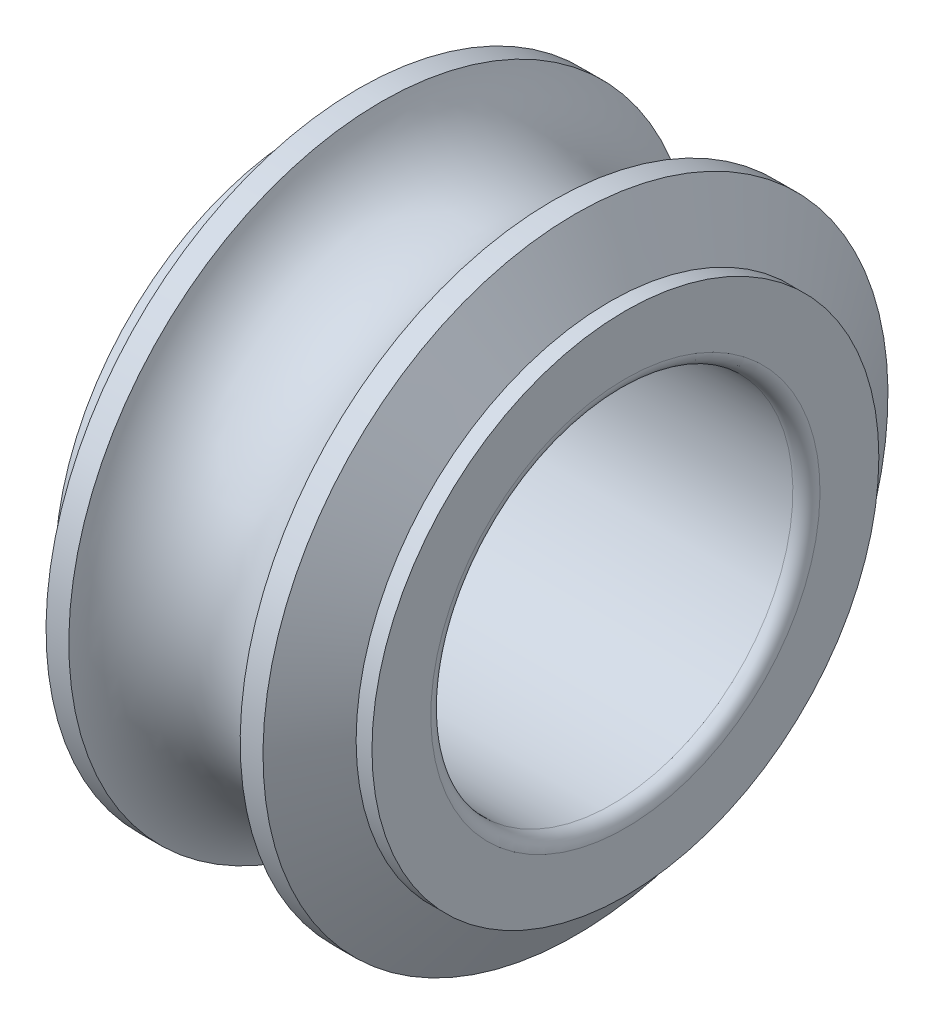
ISO-10303-21;
HEADER;
FILE_DESCRIPTION(('STEP AP214'),'2;1');
FILE_NAME('part.step','',(''),(''),'','','');
FILE_SCHEMA(('AUTOMOTIVE_DESIGN { 1 0 10303 214 1 1 1 1 }'));
ENDSEC;
DATA;
#1=APPLICATION_CONTEXT('core data for automotive mechanical design processes');
#2=APPLICATION_PROTOCOL_DEFINITION('international standard','automotive_design',2000,#1);
#3=PRODUCT_CONTEXT('',#1,'mechanical');
#4=PRODUCT('Part','Part','',(#3));
#5=PRODUCT_RELATED_PRODUCT_CATEGORY('part','',(#4));
#6=PRODUCT_DEFINITION_FORMATION('','',#4);
#7=PRODUCT_DEFINITION_CONTEXT('part definition',#1,'design');
#8=PRODUCT_DEFINITION('design','',#6,#7);
#9=PRODUCT_DEFINITION_SHAPE('','',#8);
#10=(LENGTH_UNIT() NAMED_UNIT(*) SI_UNIT(.MILLI.,.METRE.));
#11=(NAMED_UNIT(*) PLANE_ANGLE_UNIT() SI_UNIT($,.RADIAN.));
#12=(NAMED_UNIT(*) SI_UNIT($,.STERADIAN.) SOLID_ANGLE_UNIT());
#13=UNCERTAINTY_MEASURE_WITH_UNIT(LENGTH_MEASURE(1.E-05),#10,'distance_accuracy_value','');
#14=(GEOMETRIC_REPRESENTATION_CONTEXT(3) GLOBAL_UNCERTAINTY_ASSIGNED_CONTEXT((#13)) GLOBAL_UNIT_ASSIGNED_CONTEXT((#10,
#11,#12)) REPRESENTATION_CONTEXT('',''));
#15=CARTESIAN_POINT('',(0.,0.,0.));
#16=DIRECTION('',(0.,0.,1.));
#17=DIRECTION('',(1.,0.,0.));
#18=AXIS2_PLACEMENT_3D('',#15,#16,#17);
#19=CARTESIAN_POINT('',(3.5,0.,0.));
#20=DIRECTION('',(-1.,0.,0.));
#21=DIRECTION('',(0.,1.,0.));
#22=AXIS2_PLACEMENT_3D('',#19,#20,#21);
#23=CYLINDRICAL_SURFACE('',#22,4.);
#24=CARTESIAN_POINT('',(6.7,0.,0.));
#25=DIRECTION('',(1.,0.,0.));
#26=DIRECTION('',(0.,1.,0.));
#27=AXIS2_PLACEMENT_3D('',#24,#25,#26);
#28=CIRCLE('',#27,4.);
#29=CARTESIAN_POINT('',(6.7,4.,0.));
#30=VERTEX_POINT('',#29);
#31=EDGE_CURVE('E11',#30,#30,#28,.T.);
#32=ORIENTED_EDGE('',*,*,#31,.T.);
#33=EDGE_LOOP('',(#32));
#34=FACE_BOUND('',#33,.T.);
#35=CARTESIAN_POINT('',(0.3,0.,0.));
#36=DIRECTION('',(1.,0.,0.));
#37=DIRECTION('',(0.,1.,0.));
#38=AXIS2_PLACEMENT_3D('',#35,#36,#37);
#39=CIRCLE('',#38,4.);
#40=CARTESIAN_POINT('',(0.3,4.,0.));
#41=VERTEX_POINT('',#40);
#42=EDGE_CURVE('E86',#41,#41,#39,.T.);
#43=ORIENTED_EDGE('',*,*,#42,.F.);
#44=EDGE_LOOP('',(#43));
#45=FACE_BOUND('',#44,.T.);
#46=ADVANCED_FACE('F17',(#34,#45),#23,.F.);
#47=CARTESIAN_POINT('',(6.7,0.,0.));
#48=DIRECTION('',(1.,0.,0.));
#49=DIRECTION('',(0.,0.,-1.));
#50=AXIS2_PLACEMENT_3D('',#47,#48,#49);
#51=TOROIDAL_SURFACE('',#50,4.3,0.3);
#52=CARTESIAN_POINT('',(7.,0.,0.));
#53=DIRECTION('',(1.,0.,0.));
#54=DIRECTION('',(0.,1.,0.));
#55=AXIS2_PLACEMENT_3D('',#52,#53,#54);
#56=CIRCLE('',#55,4.3);
#57=CARTESIAN_POINT('',(7.,4.3,0.));
#58=VERTEX_POINT('',#57);
#59=EDGE_CURVE('E27',#58,#58,#56,.T.);
#60=ORIENTED_EDGE('',*,*,#59,.T.);
#61=EDGE_LOOP('',(#60));
#62=FACE_BOUND('',#61,.T.);
#63=ORIENTED_EDGE('',*,*,#31,.F.);
#64=EDGE_LOOP('',(#63));
#65=FACE_BOUND('',#64,.T.);
#66=ADVANCED_FACE('F115',(#62,#65),#51,.T.);
#67=CARTESIAN_POINT('',(7.,4.95,0.));
#68=DIRECTION('',(1.,0.,0.));
#69=DIRECTION('',(0.,1.,0.));
#70=AXIS2_PLACEMENT_3D('',#67,#68,#69);
#71=PLANE('',#70);
#72=CARTESIAN_POINT('',(7.,0.,0.));
#73=DIRECTION('',(1.,0.,0.));
#74=DIRECTION('',(0.,1.,0.));
#75=AXIS2_PLACEMENT_3D('',#72,#73,#74);
#76=CIRCLE('',#75,5.6);
#77=CARTESIAN_POINT('',(7.,5.6,0.));
#78=VERTEX_POINT('',#77);
#79=EDGE_CURVE('E74',#78,#78,#76,.T.);
#80=ORIENTED_EDGE('',*,*,#79,.T.);
#81=EDGE_LOOP('',(#80));
#82=FACE_BOUND('',#81,.T.);
#83=ORIENTED_EDGE('',*,*,#59,.F.);
#84=EDGE_LOOP('',(#83));
#85=FACE_BOUND('',#84,.T.);
#86=ADVANCED_FACE('F120',(#82,#85),#71,.T.);
#87=CARTESIAN_POINT('',(6.825,0.,0.));
#88=DIRECTION('',(-1.,0.,0.));
#89=DIRECTION('',(0.,1.,0.));
#90=AXIS2_PLACEMENT_3D('',#87,#88,#89);
#91=CYLINDRICAL_SURFACE('',#90,5.6);
#92=CARTESIAN_POINT('',(6.65,0.,0.));
#93=DIRECTION('',(1.,0.,0.));
#94=DIRECTION('',(0.,1.,0.));
#95=AXIS2_PLACEMENT_3D('',#92,#93,#94);
#96=CIRCLE('',#95,5.6);
#97=CARTESIAN_POINT('',(6.65,5.6,0.));
#98=VERTEX_POINT('',#97);
#99=EDGE_CURVE('E71',#98,#98,#96,.T.);
#100=ORIENTED_EDGE('',*,*,#99,.T.);
#101=EDGE_LOOP('',(#100));
#102=FACE_BOUND('',#101,.T.);
#103=ORIENTED_EDGE('',*,*,#79,.F.);
#104=EDGE_LOOP('',(#103));
#105=FACE_BOUND('',#104,.T.);
#106=ADVANCED_FACE('F132',(#102,#105),#91,.T.);
#107=CARTESIAN_POINT('',(6.27337998565088,0.,0.));
#108=DIRECTION('',(-1.,0.,0.));
#109=DIRECTION('',(0.,1.,0.));
#110=AXIS2_PLACEMENT_3D('',#107,#108,#109);
#111=CONICAL_SURFACE('',#110,6.252325,1.0471975511966);
#112=CARTESIAN_POINT('',(5.89675997130176,0.,0.));
#113=DIRECTION('',(1.,0.,0.));
#114=DIRECTION('',(0.,1.,0.));
#115=AXIS2_PLACEMENT_3D('',#112,#113,#114);
#116=CIRCLE('',#115,6.90465);
#117=CARTESIAN_POINT('',(5.89675997130176,6.90465,0.));
#118=VERTEX_POINT('',#117);
#119=EDGE_CURVE('E68',#118,#118,#116,.T.);
#120=ORIENTED_EDGE('',*,*,#119,.T.);
#121=EDGE_LOOP('',(#120));
#122=FACE_BOUND('',#121,.T.);
#123=ORIENTED_EDGE('',*,*,#99,.F.);
#124=EDGE_LOOP('',(#123));
#125=FACE_BOUND('',#124,.T.);
#126=ADVANCED_FACE('F19',(#122,#125),#111,.T.);
#127=CARTESIAN_POINT('',(5.64492615825684,0.,0.));
#128=DIRECTION('',(-1.,0.,0.));
#129=DIRECTION('',(0.,1.,0.));
#130=AXIS2_PLACEMENT_3D('',#127,#128,#129);
#131=CYLINDRICAL_SURFACE('',#130,6.90465);
#132=CARTESIAN_POINT('',(5.39309234521192,0.,0.));
#133=DIRECTION('',(1.,0.,0.));
#134=DIRECTION('',(0.,1.,0.));
#135=AXIS2_PLACEMENT_3D('',#132,#133,#134);
#136=CIRCLE('',#135,6.90465);
#137=CARTESIAN_POINT('',(5.39309234521192,6.90465,0.));
#138=VERTEX_POINT('',#137);
#139=EDGE_CURVE('E72',#138,#138,#136,.T.);
#140=ORIENTED_EDGE('',*,*,#139,.T.);
#141=EDGE_LOOP('',(#140));
#142=FACE_BOUND('',#141,.T.);
#143=ORIENTED_EDGE('',*,*,#119,.F.);
#144=EDGE_LOOP('',(#143));
#145=FACE_BOUND('',#144,.T.);
#146=ADVANCED_FACE('F124',(#142,#145),#131,.T.);
#147=CARTESIAN_POINT('',(3.5,0.,0.));
#148=DIRECTION('',(1.,0.,0.));
#149=DIRECTION('',(0.,0.,-1.));
#150=AXIS2_PLACEMENT_3D('',#147,#148,#149);
#151=TOROIDAL_SURFACE('',#150,7.5,1.9845);
#152=CARTESIAN_POINT('',(1.60690765478808,0.,0.));
#153=DIRECTION('',(1.,0.,0.));
#154=DIRECTION('',(0.,1.,0.));
#155=AXIS2_PLACEMENT_3D('',#152,#153,#154);
#156=CIRCLE('',#155,6.90465);
#157=CARTESIAN_POINT('',(1.60690765478808,6.90465,0.));
#158=VERTEX_POINT('',#157);
#159=EDGE_CURVE('E52',#158,#158,#156,.T.);
#160=ORIENTED_EDGE('',*,*,#159,.T.);
#161=EDGE_LOOP('',(#160));
#162=FACE_BOUND('',#161,.T.);
#163=ORIENTED_EDGE('',*,*,#139,.F.);
#164=EDGE_LOOP('',(#163));
#165=FACE_BOUND('',#164,.T.);
#166=ADVANCED_FACE('F126',(#162,#165),#151,.F.);
#167=CARTESIAN_POINT('',(1.35507384174316,0.,0.));
#168=DIRECTION('',(-1.,0.,0.));
#169=DIRECTION('',(0.,1.,0.));
#170=AXIS2_PLACEMENT_3D('',#167,#168,#169);
#171=CYLINDRICAL_SURFACE('',#170,6.90465);
#172=CARTESIAN_POINT('',(1.10324002869825,0.,0.));
#173=DIRECTION('',(1.,0.,0.));
#174=DIRECTION('',(0.,1.,0.));
#175=AXIS2_PLACEMENT_3D('',#172,#173,#174);
#176=CIRCLE('',#175,6.90465);
#177=CARTESIAN_POINT('',(1.10324002869825,6.90465,0.));
#178=VERTEX_POINT('',#177);
#179=EDGE_CURVE('E59',#178,#178,#176,.T.);
#180=ORIENTED_EDGE('',*,*,#179,.T.);
#181=EDGE_LOOP('',(#180));
#182=FACE_BOUND('',#181,.T.);
#183=ORIENTED_EDGE('',*,*,#159,.F.);
#184=EDGE_LOOP('',(#183));
#185=FACE_BOUND('',#184,.T.);
#186=ADVANCED_FACE('F110',(#182,#185),#171,.T.);
#187=CARTESIAN_POINT('',(0.726620014349123,0.,0.));
#188=DIRECTION('',(1.,0.,0.));
#189=DIRECTION('',(0.,1.,0.));
#190=AXIS2_PLACEMENT_3D('',#187,#188,#189);
#191=CONICAL_SURFACE('',#190,6.252325,1.0471975511966);
#192=CARTESIAN_POINT('',(0.35,0.,0.));
#193=DIRECTION('',(1.,0.,0.));
#194=DIRECTION('',(0.,1.,0.));
#195=AXIS2_PLACEMENT_3D('',#192,#193,#194);
#196=CIRCLE('',#195,5.6);
#197=CARTESIAN_POINT('',(0.35,5.6,0.));
#198=VERTEX_POINT('',#197);
#199=EDGE_CURVE('E84',#198,#198,#196,.T.);
#200=ORIENTED_EDGE('',*,*,#199,.T.);
#201=EDGE_LOOP('',(#200));
#202=FACE_BOUND('',#201,.T.);
#203=ORIENTED_EDGE('',*,*,#179,.F.);
#204=EDGE_LOOP('',(#203));
#205=FACE_BOUND('',#204,.T.);
#206=ADVANCED_FACE('F95',(#202,#205),#191,.T.);
#207=CARTESIAN_POINT('',(0.175,0.,0.));
#208=DIRECTION('',(-1.,0.,0.));
#209=DIRECTION('',(0.,1.,0.));
#210=AXIS2_PLACEMENT_3D('',#207,#208,#209);
#211=CYLINDRICAL_SURFACE('',#210,5.6);
#212=CARTESIAN_POINT('',(0.,0.,0.));
#213=DIRECTION('',(1.,0.,0.));
#214=DIRECTION('',(0.,1.,0.));
#215=AXIS2_PLACEMENT_3D('',#212,#213,#214);
#216=CIRCLE('',#215,5.6);
#217=CARTESIAN_POINT('',(0.,5.6,0.));
#218=VERTEX_POINT('',#217);
#219=EDGE_CURVE('E89',#218,#218,#216,.T.);
#220=ORIENTED_EDGE('',*,*,#219,.T.);
#221=EDGE_LOOP('',(#220));
#222=FACE_BOUND('',#221,.T.);
#223=ORIENTED_EDGE('',*,*,#199,.F.);
#224=EDGE_LOOP('',(#223));
#225=FACE_BOUND('',#224,.T.);
#226=ADVANCED_FACE('F98',(#222,#225),#211,.T.);
#227=CARTESIAN_POINT('',(0.,4.95,0.));
#228=DIRECTION('',(-1.,0.,0.));
#229=DIRECTION('',(0.,-1.,0.));
#230=AXIS2_PLACEMENT_3D('',#227,#228,#229);
#231=PLANE('',#230);
#232=CARTESIAN_POINT('',(0.,0.,0.));
#233=DIRECTION('',(1.,0.,0.));
#234=DIRECTION('',(0.,1.,0.));
#235=AXIS2_PLACEMENT_3D('',#232,#233,#234);
#236=CIRCLE('',#235,4.3);
#237=CARTESIAN_POINT('',(0.,4.3,0.));
#238=VERTEX_POINT('',#237);
#239=EDGE_CURVE('E21',#238,#238,#236,.T.);
#240=ORIENTED_EDGE('',*,*,#239,.T.);
#241=EDGE_LOOP('',(#240));
#242=FACE_BOUND('',#241,.T.);
#243=ORIENTED_EDGE('',*,*,#219,.F.);
#244=EDGE_LOOP('',(#243));
#245=FACE_BOUND('',#244,.T.);
#246=ADVANCED_FACE('F100',(#242,#245),#231,.T.);
#247=CARTESIAN_POINT('',(0.3,0.,0.));
#248=DIRECTION('',(1.,0.,0.));
#249=DIRECTION('',(0.,0.,-1.));
#250=AXIS2_PLACEMENT_3D('',#247,#248,#249);
#251=TOROIDAL_SURFACE('',#250,4.3,0.3);
#252=ORIENTED_EDGE('',*,*,#42,.T.);
#253=EDGE_LOOP('',(#252));
#254=FACE_BOUND('',#253,.T.);
#255=ORIENTED_EDGE('',*,*,#239,.F.);
#256=EDGE_LOOP('',(#255));
#257=FACE_BOUND('',#256,.T.);
#258=ADVANCED_FACE('F107',(#254,#257),#251,.T.);
#259=CLOSED_SHELL('',(#46,#66,#86,#106,#126,#146,#166,#186,#206,#226,#246,#258));
#260=MANIFOLD_SOLID_BREP('B1',#259);
#261=ADVANCED_BREP_SHAPE_REPRESENTATION('',(#18,#260),#14);
#262=SHAPE_DEFINITION_REPRESENTATION(#9,#261);
ENDSEC;
END-ISO-10303-21;
